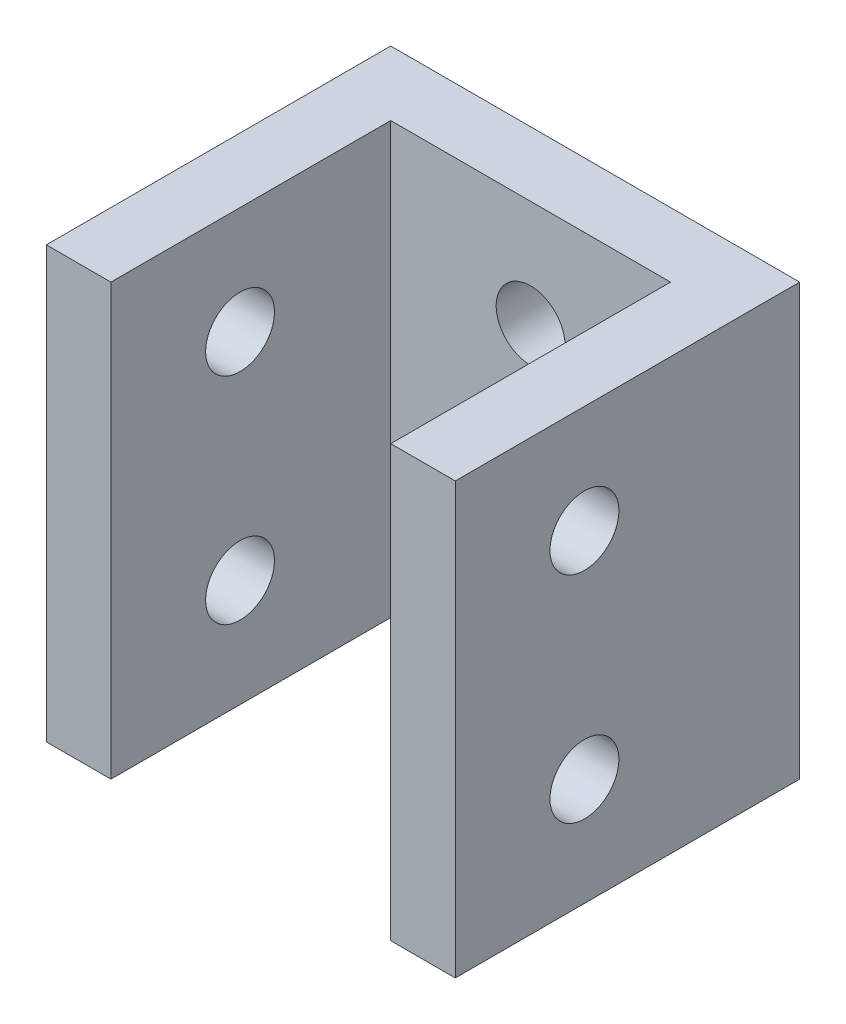
ISO-10303-21;
HEADER;
FILE_DESCRIPTION(('STEP AP214'),'2;1');
FILE_NAME('part.step','',(''),(''),'','','');
FILE_SCHEMA(('AUTOMOTIVE_DESIGN { 1 0 10303 214 1 1 1 1 }'));
ENDSEC;
DATA;
#1=APPLICATION_CONTEXT('core data for automotive mechanical design processes');
#2=APPLICATION_PROTOCOL_DEFINITION('international standard','automotive_design',2000,#1);
#3=PRODUCT_CONTEXT('',#1,'mechanical');
#4=PRODUCT('Part','Part','',(#3));
#5=PRODUCT_RELATED_PRODUCT_CATEGORY('part','',(#4));
#6=PRODUCT_DEFINITION_FORMATION('','',#4);
#7=PRODUCT_DEFINITION_CONTEXT('part definition',#1,'design');
#8=PRODUCT_DEFINITION('design','',#6,#7);
#9=PRODUCT_DEFINITION_SHAPE('','',#8);
#10=(LENGTH_UNIT() NAMED_UNIT(*) SI_UNIT(.MILLI.,.METRE.));
#11=(NAMED_UNIT(*) PLANE_ANGLE_UNIT() SI_UNIT($,.RADIAN.));
#12=(NAMED_UNIT(*) SI_UNIT($,.STERADIAN.) SOLID_ANGLE_UNIT());
#13=UNCERTAINTY_MEASURE_WITH_UNIT(LENGTH_MEASURE(1.E-05),#10,'distance_accuracy_value','');
#14=(GEOMETRIC_REPRESENTATION_CONTEXT(3) GLOBAL_UNCERTAINTY_ASSIGNED_CONTEXT((#13)) GLOBAL_UNIT_ASSIGNED_CONTEXT((#10,
#11,#12)) REPRESENTATION_CONTEXT('',''));
#15=CARTESIAN_POINT('',(0.,0.,0.));
#16=DIRECTION('',(0.,0.,1.));
#17=DIRECTION('',(1.,0.,0.));
#18=AXIS2_PLACEMENT_3D('',#15,#16,#17);
#19=CARTESIAN_POINT('',(0.,0.,3.));
#20=DIRECTION('',(0.,0.,-1.));
#21=DIRECTION('',(-1.,0.,0.));
#22=AXIS2_PLACEMENT_3D('',#19,#20,#21);
#23=PLANE('',#22);
#24=CARTESIAN_POINT('',(263.488347113193,-48.1088667947392,3.));
#25=DIRECTION('',(0.,0.,1.));
#26=DIRECTION('',(1.,0.,0.));
#27=AXIS2_PLACEMENT_3D('',#24,#25,#26);
#28=CIRCLE('',#27,1.59999999999996);
#29=CARTESIAN_POINT('',(265.088347113193,-48.1088667947392,3.));
#30=VERTEX_POINT('',#29);
#31=EDGE_CURVE('E142',#30,#30,#28,.T.);
#32=ORIENTED_EDGE('',*,*,#31,.F.);
#33=EDGE_LOOP('',(#32));
#34=FACE_BOUND('',#33,.T.);
#35=CARTESIAN_POINT('',(263.488347113193,-58.1088667947392,3.));
#36=DIRECTION('',(0.,0.,1.));
#37=DIRECTION('',(1.,0.,0.));
#38=AXIS2_PLACEMENT_3D('',#35,#36,#37);
#39=CIRCLE('',#38,1.59999999999996);
#40=CARTESIAN_POINT('',(265.088347113193,-58.1088667947392,3.));
#41=VERTEX_POINT('',#40);
#42=EDGE_CURVE('E200',#41,#41,#39,.T.);
#43=ORIENTED_EDGE('',*,*,#42,.F.);
#44=EDGE_LOOP('',(#43));
#45=FACE_BOUND('',#44,.T.);
#46=DIRECTION('',(0.,-1.,0.));
#47=VECTOR('',#46,1.);
#48=CARTESIAN_POINT('',(269.988347113193,-43.1088667947392,3.));
#49=LINE('',#48,#47);
#50=CARTESIAN_POINT('',(269.988347113193,-43.1088667947392,3.));
#51=VERTEX_POINT('',#50);
#52=CARTESIAN_POINT('',(269.988347113193,-63.1088667947392,3.));
#53=VERTEX_POINT('',#52);
#54=EDGE_CURVE('E164',#51,#53,#49,.T.);
#55=ORIENTED_EDGE('',*,*,#54,.F.);
#56=DIRECTION('',(-1.,0.,0.));
#57=VECTOR('',#56,1.);
#58=CARTESIAN_POINT('',(253.988347113193,-43.1088667947392,3.));
#59=LINE('',#58,#57);
#60=CARTESIAN_POINT('',(256.988347113193,-43.1088667947392,3.));
#61=VERTEX_POINT('',#60);
#62=EDGE_CURVE('E117',#51,#61,#59,.T.);
#63=ORIENTED_EDGE('',*,*,#62,.T.);
#64=DIRECTION('',(0.,1.,0.));
#65=VECTOR('',#64,1.);
#66=CARTESIAN_POINT('',(256.988347113193,-63.1088667947392,3.));
#67=LINE('',#66,#65);
#68=CARTESIAN_POINT('',(256.988347113193,-63.1088667947392,3.));
#69=VERTEX_POINT('',#68);
#70=EDGE_CURVE('E171',#69,#61,#67,.T.);
#71=ORIENTED_EDGE('',*,*,#70,.F.);
#72=DIRECTION('',(1.,0.,0.));
#73=VECTOR('',#72,1.);
#74=CARTESIAN_POINT('',(253.988347113193,-63.1088667947392,3.));
#75=LINE('',#74,#73);
#76=EDGE_CURVE('E122',#69,#53,#75,.T.);
#77=ORIENTED_EDGE('',*,*,#76,.T.);
#78=EDGE_LOOP('',(#55,#63,#71,#77));
#79=FACE_BOUND('',#78,.T.);
#80=ADVANCED_FACE('F35',(#34,#45,#79),#23,.F.);
#81=CARTESIAN_POINT('',(253.988347113193,-63.1088667947392,3.));
#82=DIRECTION('',(1.,0.,0.));
#83=DIRECTION('',(0.,0.,-1.));
#84=AXIS2_PLACEMENT_3D('',#81,#82,#83);
#85=PLANE('',#84);
#86=CARTESIAN_POINT('',(253.988347113193,-48.1088667947392,10.));
#87=DIRECTION('',(-1.,0.,0.));
#88=DIRECTION('',(0.,0.,1.));
#89=AXIS2_PLACEMENT_3D('',#86,#87,#88);
#90=CIRCLE('',#89,1.6);
#91=CARTESIAN_POINT('',(253.988347113193,-48.1088667947392,11.6));
#92=VERTEX_POINT('',#91);
#93=EDGE_CURVE('E133',#92,#92,#90,.T.);
#94=ORIENTED_EDGE('',*,*,#93,.F.);
#95=EDGE_LOOP('',(#94));
#96=FACE_BOUND('',#95,.T.);
#97=CARTESIAN_POINT('',(253.988347113193,-58.1088667947392,10.));
#98=DIRECTION('',(-1.,0.,0.));
#99=DIRECTION('',(0.,0.,1.));
#100=AXIS2_PLACEMENT_3D('',#97,#98,#99);
#101=CIRCLE('',#100,1.6);
#102=CARTESIAN_POINT('',(253.988347113193,-58.1088667947392,11.6));
#103=VERTEX_POINT('',#102);
#104=EDGE_CURVE('E144',#103,#103,#101,.T.);
#105=ORIENTED_EDGE('',*,*,#104,.F.);
#106=EDGE_LOOP('',(#105));
#107=FACE_BOUND('',#106,.T.);
#108=DIRECTION('',(0.,0.,-1.));
#109=VECTOR('',#108,1.);
#110=CARTESIAN_POINT('',(253.988347113193,-63.1088667947392,3.));
#111=LINE('',#110,#109);
#112=CARTESIAN_POINT('',(253.988347113193,-63.1088667947392,16.));
#113=VERTEX_POINT('',#112);
#114=CARTESIAN_POINT('',(253.988347113193,-63.1088667947392,0.));
#115=VERTEX_POINT('',#114);
#116=EDGE_CURVE('E43',#113,#115,#111,.T.);
#117=ORIENTED_EDGE('',*,*,#116,.F.);
#118=DIRECTION('',(0.,-1.,0.));
#119=VECTOR('',#118,1.);
#120=CARTESIAN_POINT('',(253.988347113193,-43.1088667947392,16.));
#121=LINE('',#120,#119);
#122=CARTESIAN_POINT('',(253.988347113193,-43.1088667947392,16.));
#123=VERTEX_POINT('',#122);
#124=EDGE_CURVE('E100',#123,#113,#121,.T.);
#125=ORIENTED_EDGE('',*,*,#124,.F.);
#126=DIRECTION('',(0.,0.,-1.));
#127=VECTOR('',#126,1.);
#128=CARTESIAN_POINT('',(253.988347113193,-43.1088667947392,3.));
#129=LINE('',#128,#127);
#130=CARTESIAN_POINT('',(253.988347113193,-43.1088667947392,0.));
#131=VERTEX_POINT('',#130);
#132=EDGE_CURVE('E109',#123,#131,#129,.T.);
#133=ORIENTED_EDGE('',*,*,#132,.T.);
#134=DIRECTION('',(0.,-1.,0.));
#135=VECTOR('',#134,1.);
#136=CARTESIAN_POINT('',(253.988347113193,-63.1088667947392,0.));
#137=LINE('',#136,#135);
#138=EDGE_CURVE('E178',#131,#115,#137,.T.);
#139=ORIENTED_EDGE('',*,*,#138,.T.);
#140=EDGE_LOOP('',(#117,#125,#133,#139));
#141=FACE_BOUND('',#140,.T.);
#142=ADVANCED_FACE('F37',(#96,#107,#141),#85,.F.);
#143=CARTESIAN_POINT('',(253.988347113193,-63.1088667947392,3.));
#144=DIRECTION('',(0.,1.,0.));
#145=DIRECTION('',(0.,0.,1.));
#146=AXIS2_PLACEMENT_3D('',#143,#144,#145);
#147=PLANE('',#146);
#148=DIRECTION('',(0.,0.,-1.));
#149=VECTOR('',#148,1.);
#150=CARTESIAN_POINT('',(272.988347113193,-63.1088667947392,3.));
#151=LINE('',#150,#149);
#152=CARTESIAN_POINT('',(272.988347113193,-63.1088667947392,16.));
#153=VERTEX_POINT('',#152);
#154=CARTESIAN_POINT('',(272.988347113193,-63.1088667947392,0.));
#155=VERTEX_POINT('',#154);
#156=EDGE_CURVE('E119',#153,#155,#151,.T.);
#157=ORIENTED_EDGE('',*,*,#156,.F.);
#158=DIRECTION('',(-1.,0.,0.));
#159=VECTOR('',#158,1.);
#160=CARTESIAN_POINT('',(253.988347113193,-63.1088667947392,16.));
#161=LINE('',#160,#159);
#162=CARTESIAN_POINT('',(269.988347113193,-63.1088667947392,16.));
#163=VERTEX_POINT('',#162);
#164=EDGE_CURVE('E202',#153,#163,#161,.T.);
#165=ORIENTED_EDGE('',*,*,#164,.T.);
#166=DIRECTION('',(0.,0.,-1.));
#167=VECTOR('',#166,1.);
#168=CARTESIAN_POINT('',(269.988347113193,-63.1088667947392,18.));
#169=LINE('',#168,#167);
#170=EDGE_CURVE('E167',#163,#53,#169,.T.);
#171=ORIENTED_EDGE('',*,*,#170,.T.);
#172=ORIENTED_EDGE('',*,*,#76,.F.);
#173=DIRECTION('',(0.,0.,-1.));
#174=VECTOR('',#173,1.);
#175=CARTESIAN_POINT('',(256.988347113193,-63.1088667947392,18.));
#176=LINE('',#175,#174);
#177=CARTESIAN_POINT('',(256.988347113193,-63.1088667947392,16.));
#178=VERTEX_POINT('',#177);
#179=EDGE_CURVE('E176',#178,#69,#176,.T.);
#180=ORIENTED_EDGE('',*,*,#179,.F.);
#181=EDGE_CURVE('E50',#178,#113,#161,.T.);
#182=ORIENTED_EDGE('',*,*,#181,.T.);
#183=ORIENTED_EDGE('',*,*,#116,.T.);
#184=DIRECTION('',(1.,0.,0.));
#185=VECTOR('',#184,1.);
#186=CARTESIAN_POINT('',(253.988347113193,-63.1088667947392,0.));
#187=LINE('',#186,#185);
#188=EDGE_CURVE('E182',#115,#155,#187,.T.);
#189=ORIENTED_EDGE('',*,*,#188,.T.);
#190=EDGE_LOOP('',(#157,#165,#171,#172,#180,#182,#183,#189));
#191=FACE_BOUND('',#190,.T.);
#192=ADVANCED_FACE('F196',(#191),#147,.F.);
#193=CARTESIAN_POINT('',(272.988347113193,-63.1088667947392,3.));
#194=DIRECTION('',(-1.,0.,0.));
#195=DIRECTION('',(0.,0.,1.));
#196=AXIS2_PLACEMENT_3D('',#193,#194,#195);
#197=PLANE('',#196);
#198=CARTESIAN_POINT('',(272.988347113193,-48.1088667947392,10.));
#199=DIRECTION('',(-1.,0.,0.));
#200=DIRECTION('',(0.,0.,1.));
#201=AXIS2_PLACEMENT_3D('',#198,#199,#200);
#202=CIRCLE('',#201,1.6);
#203=CARTESIAN_POINT('',(272.988347113193,-48.1088667947392,11.6));
#204=VERTEX_POINT('',#203);
#205=EDGE_CURVE('E161',#204,#204,#202,.T.);
#206=ORIENTED_EDGE('',*,*,#205,.T.);
#207=EDGE_LOOP('',(#206));
#208=FACE_BOUND('',#207,.T.);
#209=CARTESIAN_POINT('',(272.988347113193,-58.1088667947392,10.));
#210=DIRECTION('',(-1.,0.,0.));
#211=DIRECTION('',(0.,0.,1.));
#212=AXIS2_PLACEMENT_3D('',#209,#210,#211);
#213=CIRCLE('',#212,1.6);
#214=CARTESIAN_POINT('',(272.988347113193,-58.1088667947392,11.6));
#215=VERTEX_POINT('',#214);
#216=EDGE_CURVE('E138',#215,#215,#213,.T.);
#217=ORIENTED_EDGE('',*,*,#216,.T.);
#218=EDGE_LOOP('',(#217));
#219=FACE_BOUND('',#218,.T.);
#220=DIRECTION('',(0.,0.,-1.));
#221=VECTOR('',#220,1.);
#222=CARTESIAN_POINT('',(272.988347113193,-43.1088667947392,3.));
#223=LINE('',#222,#221);
#224=CARTESIAN_POINT('',(272.988347113193,-43.1088667947392,16.));
#225=VERTEX_POINT('',#224);
#226=CARTESIAN_POINT('',(272.988347113193,-43.1088667947392,0.));
#227=VERTEX_POINT('',#226);
#228=EDGE_CURVE('E116',#225,#227,#223,.T.);
#229=ORIENTED_EDGE('',*,*,#228,.F.);
#230=DIRECTION('',(0.,-1.,0.));
#231=VECTOR('',#230,1.);
#232=CARTESIAN_POINT('',(272.988347113193,-63.1088667947392,16.));
#233=LINE('',#232,#231);
#234=EDGE_CURVE('E204',#225,#153,#233,.T.);
#235=ORIENTED_EDGE('',*,*,#234,.T.);
#236=ORIENTED_EDGE('',*,*,#156,.T.);
#237=DIRECTION('',(0.,1.,0.));
#238=VECTOR('',#237,1.);
#239=CARTESIAN_POINT('',(272.988347113193,-63.1088667947392,0.));
#240=LINE('',#239,#238);
#241=EDGE_CURVE('E184',#155,#227,#240,.T.);
#242=ORIENTED_EDGE('',*,*,#241,.T.);
#243=EDGE_LOOP('',(#229,#235,#236,#242));
#244=FACE_BOUND('',#243,.T.);
#245=ADVANCED_FACE('F189',(#208,#219,#244),#197,.F.);
#246=CARTESIAN_POINT('',(253.988347113193,-43.1088667947392,3.));
#247=DIRECTION('',(0.,-1.,0.));
#248=DIRECTION('',(0.,0.,-1.));
#249=AXIS2_PLACEMENT_3D('',#246,#247,#248);
#250=PLANE('',#249);
#251=ORIENTED_EDGE('',*,*,#132,.F.);
#252=DIRECTION('',(-1.,0.,0.));
#253=VECTOR('',#252,1.);
#254=CARTESIAN_POINT('',(282.988347113193,-43.1088667947392,16.));
#255=LINE('',#254,#253);
#256=CARTESIAN_POINT('',(256.988347113193,-43.1088667947392,16.));
#257=VERTEX_POINT('',#256);
#258=EDGE_CURVE('E97',#257,#123,#255,.T.);
#259=ORIENTED_EDGE('',*,*,#258,.F.);
#260=DIRECTION('',(0.,0.,-1.));
#261=VECTOR('',#260,1.);
#262=CARTESIAN_POINT('',(256.988347113193,-43.1088667947392,18.));
#263=LINE('',#262,#261);
#264=EDGE_CURVE('E174',#257,#61,#263,.T.);
#265=ORIENTED_EDGE('',*,*,#264,.T.);
#266=ORIENTED_EDGE('',*,*,#62,.F.);
#267=DIRECTION('',(0.,0.,-1.));
#268=VECTOR('',#267,1.);
#269=CARTESIAN_POINT('',(269.988347113193,-43.1088667947392,18.));
#270=LINE('',#269,#268);
#271=CARTESIAN_POINT('',(269.988347113193,-43.1088667947392,16.));
#272=VERTEX_POINT('',#271);
#273=EDGE_CURVE('E169',#272,#51,#270,.T.);
#274=ORIENTED_EDGE('',*,*,#273,.F.);
#275=EDGE_CURVE('E58',#225,#272,#255,.T.);
#276=ORIENTED_EDGE('',*,*,#275,.F.);
#277=ORIENTED_EDGE('',*,*,#228,.T.);
#278=DIRECTION('',(-1.,0.,0.));
#279=VECTOR('',#278,1.);
#280=CARTESIAN_POINT('',(253.988347113193,-43.1088667947392,0.));
#281=LINE('',#280,#279);
#282=EDGE_CURVE('E114',#227,#131,#281,.T.);
#283=ORIENTED_EDGE('',*,*,#282,.T.);
#284=EDGE_LOOP('',(#251,#259,#265,#266,#274,#276,#277,#283));
#285=FACE_BOUND('',#284,.T.);
#286=ADVANCED_FACE('F112',(#285),#250,.F.);
#287=CARTESIAN_POINT('',(0.,0.,0.));
#288=DIRECTION('',(0.,0.,-1.));
#289=DIRECTION('',(-1.,0.,0.));
#290=AXIS2_PLACEMENT_3D('',#287,#288,#289);
#291=PLANE('',#290);
#292=CARTESIAN_POINT('',(263.488347113193,-48.1088667947392,0.));
#293=DIRECTION('',(0.,0.,-1.));
#294=DIRECTION('',(-1.,0.,0.));
#295=AXIS2_PLACEMENT_3D('',#292,#293,#294);
#296=CIRCLE('',#295,1.59999999999996);
#297=CARTESIAN_POINT('',(261.888347113193,-48.1088667947392,0.));
#298=VERTEX_POINT('',#297);
#299=EDGE_CURVE('E141',#298,#298,#296,.T.);
#300=ORIENTED_EDGE('',*,*,#299,.F.);
#301=EDGE_LOOP('',(#300));
#302=FACE_BOUND('',#301,.T.);
#303=CARTESIAN_POINT('',(263.488347113193,-58.1088667947392,0.));
#304=DIRECTION('',(0.,0.,-1.));
#305=DIRECTION('',(-1.,0.,0.));
#306=AXIS2_PLACEMENT_3D('',#303,#304,#305);
#307=CIRCLE('',#306,1.59999999999996);
#308=CARTESIAN_POINT('',(261.888347113193,-58.1088667947392,0.));
#309=VERTEX_POINT('',#308);
#310=EDGE_CURVE('E139',#309,#309,#307,.T.);
#311=ORIENTED_EDGE('',*,*,#310,.F.);
#312=EDGE_LOOP('',(#311));
#313=FACE_BOUND('',#312,.T.);
#314=ORIENTED_EDGE('',*,*,#138,.F.);
#315=ORIENTED_EDGE('',*,*,#282,.F.);
#316=ORIENTED_EDGE('',*,*,#241,.F.);
#317=ORIENTED_EDGE('',*,*,#188,.F.);
#318=EDGE_LOOP('',(#314,#315,#316,#317));
#319=FACE_BOUND('',#318,.T.);
#320=ADVANCED_FACE('F194',(#302,#313,#319),#291,.T.);
#321=CARTESIAN_POINT('',(256.988347113193,-63.1088667947392,18.));
#322=DIRECTION('',(-1.,0.,0.));
#323=DIRECTION('',(0.,0.,1.));
#324=AXIS2_PLACEMENT_3D('',#321,#322,#323);
#325=PLANE('',#324);
#326=CARTESIAN_POINT('',(256.988347113193,-48.1088667947392,10.));
#327=DIRECTION('',(-1.,0.,0.));
#328=DIRECTION('',(0.,0.,1.));
#329=AXIS2_PLACEMENT_3D('',#326,#327,#328);
#330=CIRCLE('',#329,1.6);
#331=CARTESIAN_POINT('',(256.988347113193,-48.1088667947392,11.6));
#332=VERTEX_POINT('',#331);
#333=EDGE_CURVE('E137',#332,#332,#330,.T.);
#334=ORIENTED_EDGE('',*,*,#333,.T.);
#335=EDGE_LOOP('',(#334));
#336=FACE_BOUND('',#335,.T.);
#337=CARTESIAN_POINT('',(256.988347113193,-58.1088667947392,10.));
#338=DIRECTION('',(-1.,0.,0.));
#339=DIRECTION('',(0.,0.,1.));
#340=AXIS2_PLACEMENT_3D('',#337,#338,#339);
#341=CIRCLE('',#340,1.6);
#342=CARTESIAN_POINT('',(256.988347113193,-58.1088667947392,11.6));
#343=VERTEX_POINT('',#342);
#344=EDGE_CURVE('E132',#343,#343,#341,.T.);
#345=ORIENTED_EDGE('',*,*,#344,.T.);
#346=EDGE_LOOP('',(#345));
#347=FACE_BOUND('',#346,.T.);
#348=ORIENTED_EDGE('',*,*,#264,.F.);
#349=DIRECTION('',(0.,-1.,0.));
#350=VECTOR('',#349,1.);
#351=CARTESIAN_POINT('',(256.988347113193,-63.1088667947392,16.));
#352=LINE('',#351,#350);
#353=EDGE_CURVE('E101',#257,#178,#352,.T.);
#354=ORIENTED_EDGE('',*,*,#353,.T.);
#355=ORIENTED_EDGE('',*,*,#179,.T.);
#356=ORIENTED_EDGE('',*,*,#70,.T.);
#357=EDGE_LOOP('',(#348,#354,#355,#356));
#358=FACE_BOUND('',#357,.T.);
#359=ADVANCED_FACE('F226',(#336,#347,#358),#325,.F.);
#360=CARTESIAN_POINT('',(269.988347113193,-43.1088667947392,18.));
#361=DIRECTION('',(1.,0.,0.));
#362=DIRECTION('',(0.,0.,-1.));
#363=AXIS2_PLACEMENT_3D('',#360,#361,#362);
#364=PLANE('',#363);
#365=CARTESIAN_POINT('',(269.988347113193,-48.1088667947392,10.));
#366=DIRECTION('',(1.,0.,0.));
#367=DIRECTION('',(0.,0.,-1.));
#368=AXIS2_PLACEMENT_3D('',#365,#366,#367);
#369=CIRCLE('',#368,1.6);
#370=CARTESIAN_POINT('',(269.988347113193,-48.1088667947392,8.4));
#371=VERTEX_POINT('',#370);
#372=EDGE_CURVE('E134',#371,#371,#369,.T.);
#373=ORIENTED_EDGE('',*,*,#372,.T.);
#374=EDGE_LOOP('',(#373));
#375=FACE_BOUND('',#374,.T.);
#376=CARTESIAN_POINT('',(269.988347113193,-58.1088667947392,10.));
#377=DIRECTION('',(1.,0.,0.));
#378=DIRECTION('',(0.,0.,-1.));
#379=AXIS2_PLACEMENT_3D('',#376,#377,#378);
#380=CIRCLE('',#379,1.6);
#381=CARTESIAN_POINT('',(269.988347113193,-58.1088667947392,8.4));
#382=VERTEX_POINT('',#381);
#383=EDGE_CURVE('E129',#382,#382,#380,.T.);
#384=ORIENTED_EDGE('',*,*,#383,.T.);
#385=EDGE_LOOP('',(#384));
#386=FACE_BOUND('',#385,.T.);
#387=ORIENTED_EDGE('',*,*,#170,.F.);
#388=DIRECTION('',(0.,1.,0.));
#389=VECTOR('',#388,1.);
#390=CARTESIAN_POINT('',(269.988347113193,-43.1088667947392,16.));
#391=LINE('',#390,#389);
#392=EDGE_CURVE('E11',#163,#272,#391,.T.);
#393=ORIENTED_EDGE('',*,*,#392,.T.);
#394=ORIENTED_EDGE('',*,*,#273,.T.);
#395=ORIENTED_EDGE('',*,*,#54,.T.);
#396=EDGE_LOOP('',(#387,#393,#394,#395));
#397=FACE_BOUND('',#396,.T.);
#398=ADVANCED_FACE('F223',(#375,#386,#397),#364,.F.);
#399=CARTESIAN_POINT('',(283.988347113193,-58.1088667947392,10.));
#400=DIRECTION('',(-1.,0.,0.));
#401=DIRECTION('',(0.,0.,1.));
#402=AXIS2_PLACEMENT_3D('',#399,#400,#401);
#403=CYLINDRICAL_SURFACE('',#402,1.6);
#404=ORIENTED_EDGE('',*,*,#383,.F.);
#405=EDGE_LOOP('',(#404));
#406=FACE_BOUND('',#405,.T.);
#407=ORIENTED_EDGE('',*,*,#216,.F.);
#408=EDGE_LOOP('',(#407));
#409=FACE_BOUND('',#408,.T.);
#410=ADVANCED_FACE('F234',(#406,#409),#403,.F.);
#411=CARTESIAN_POINT('',(283.988347113193,-48.1088667947392,10.));
#412=DIRECTION('',(-1.,0.,0.));
#413=DIRECTION('',(0.,0.,1.));
#414=AXIS2_PLACEMENT_3D('',#411,#412,#413);
#415=CYLINDRICAL_SURFACE('',#414,1.6);
#416=ORIENTED_EDGE('',*,*,#372,.F.);
#417=EDGE_LOOP('',(#416));
#418=FACE_BOUND('',#417,.T.);
#419=ORIENTED_EDGE('',*,*,#205,.F.);
#420=EDGE_LOOP('',(#419));
#421=FACE_BOUND('',#420,.T.);
#422=ADVANCED_FACE('F263',(#418,#421),#415,.F.);
#423=ORIENTED_EDGE('',*,*,#104,.T.);
#424=EDGE_LOOP('',(#423));
#425=FACE_BOUND('',#424,.T.);
#426=ORIENTED_EDGE('',*,*,#344,.F.);
#427=EDGE_LOOP('',(#426));
#428=FACE_BOUND('',#427,.T.);
#429=ADVANCED_FACE('F261',(#425,#428),#403,.F.);
#430=ORIENTED_EDGE('',*,*,#93,.T.);
#431=EDGE_LOOP('',(#430));
#432=FACE_BOUND('',#431,.T.);
#433=ORIENTED_EDGE('',*,*,#333,.F.);
#434=EDGE_LOOP('',(#433));
#435=FACE_BOUND('',#434,.T.);
#436=ADVANCED_FACE('F257',(#432,#435),#415,.F.);
#437=CARTESIAN_POINT('',(263.488347113193,-58.1088667947392,-27.));
#438=DIRECTION('',(0.,0.,1.));
#439=DIRECTION('',(1.,0.,0.));
#440=AXIS2_PLACEMENT_3D('',#437,#438,#439);
#441=CYLINDRICAL_SURFACE('',#440,1.59999999999996);
#442=ORIENTED_EDGE('',*,*,#310,.T.);
#443=EDGE_LOOP('',(#442));
#444=FACE_BOUND('',#443,.T.);
#445=ORIENTED_EDGE('',*,*,#42,.T.);
#446=EDGE_LOOP('',(#445));
#447=FACE_BOUND('',#446,.T.);
#448=ADVANCED_FACE('F260',(#444,#447),#441,.F.);
#449=CARTESIAN_POINT('',(263.488347113193,-48.1088667947392,-27.));
#450=DIRECTION('',(0.,0.,1.));
#451=DIRECTION('',(1.,0.,0.));
#452=AXIS2_PLACEMENT_3D('',#449,#450,#451);
#453=CYLINDRICAL_SURFACE('',#452,1.59999999999996);
#454=ORIENTED_EDGE('',*,*,#299,.T.);
#455=EDGE_LOOP('',(#454));
#456=FACE_BOUND('',#455,.T.);
#457=ORIENTED_EDGE('',*,*,#31,.T.);
#458=EDGE_LOOP('',(#457));
#459=FACE_BOUND('',#458,.T.);
#460=ADVANCED_FACE('F212',(#456,#459),#453,.F.);
#461=CARTESIAN_POINT('',(282.988347113193,-43.1088667947392,16.));
#462=DIRECTION('',(0.,0.,-1.));
#463=DIRECTION('',(0.,1.,0.));
#464=AXIS2_PLACEMENT_3D('',#461,#462,#463);
#465=PLANE('',#464);
#466=ORIENTED_EDGE('',*,*,#275,.T.);
#467=ORIENTED_EDGE('',*,*,#392,.F.);
#468=ORIENTED_EDGE('',*,*,#164,.F.);
#469=ORIENTED_EDGE('',*,*,#234,.F.);
#470=EDGE_LOOP('',(#466,#467,#468,#469));
#471=FACE_BOUND('',#470,.T.);
#472=ADVANCED_FACE('F363',(#471),#465,.F.);
#473=ORIENTED_EDGE('',*,*,#353,.F.);
#474=ORIENTED_EDGE('',*,*,#258,.T.);
#475=ORIENTED_EDGE('',*,*,#124,.T.);
#476=ORIENTED_EDGE('',*,*,#181,.F.);
#477=EDGE_LOOP('',(#473,#474,#475,#476));
#478=FACE_BOUND('',#477,.T.);
#479=ADVANCED_FACE('F99',(#478),#465,.F.);
#480=CLOSED_SHELL('',(#80,#142,#192,#245,#286,#320,#359,#398,#410,#422,#429,#436,#448,#460,#472,#479));
#481=MANIFOLD_SOLID_BREP('B2',#480);
#482=ADVANCED_BREP_SHAPE_REPRESENTATION('',(#18,#481),#14);
#483=SHAPE_DEFINITION_REPRESENTATION(#9,#482);
ENDSEC;
END-ISO-10303-21;
